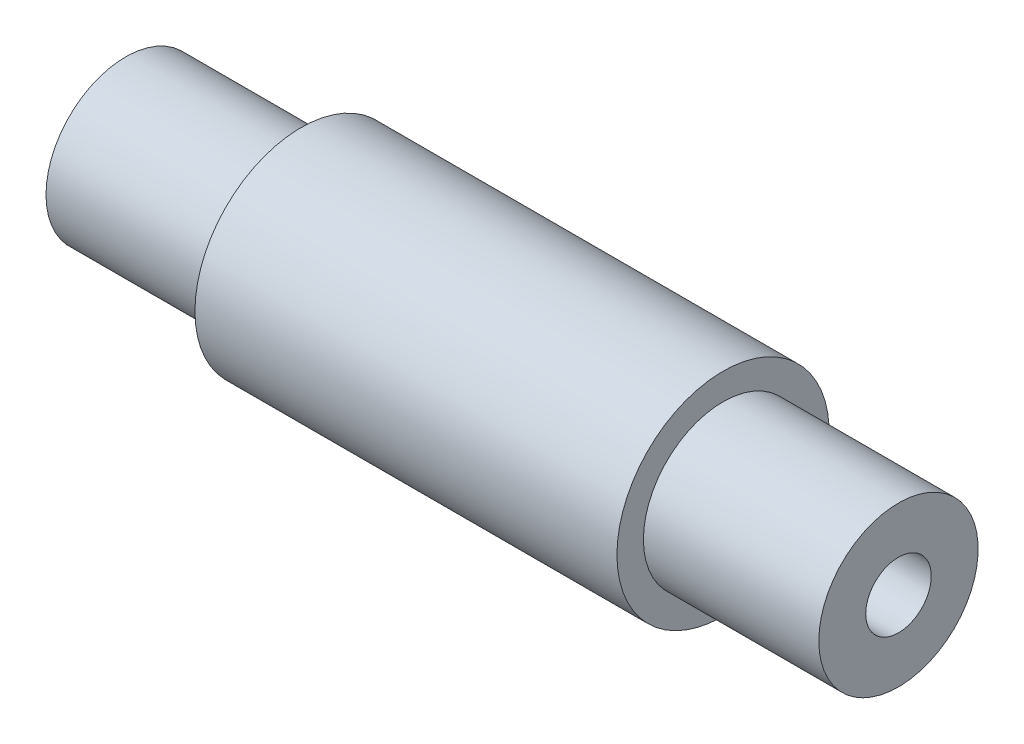
ISO-10303-21;
HEADER;
FILE_DESCRIPTION(('STEP AP214'),'2;1');
FILE_NAME('part.step','',(''),(''),'','','');
FILE_SCHEMA(('AUTOMOTIVE_DESIGN { 1 0 10303 214 1 1 1 1 }'));
ENDSEC;
DATA;
#1=APPLICATION_CONTEXT('core data for automotive mechanical design processes');
#2=APPLICATION_PROTOCOL_DEFINITION('international standard','automotive_design',2000,#1);
#3=PRODUCT_CONTEXT('',#1,'mechanical');
#4=PRODUCT('Part','Part','',(#3));
#5=PRODUCT_RELATED_PRODUCT_CATEGORY('part','',(#4));
#6=PRODUCT_DEFINITION_FORMATION('','',#4);
#7=PRODUCT_DEFINITION_CONTEXT('part definition',#1,'design');
#8=PRODUCT_DEFINITION('design','',#6,#7);
#9=PRODUCT_DEFINITION_SHAPE('','',#8);
#10=(LENGTH_UNIT() NAMED_UNIT(*) SI_UNIT(.MILLI.,.METRE.));
#11=(NAMED_UNIT(*) PLANE_ANGLE_UNIT() SI_UNIT($,.RADIAN.));
#12=(NAMED_UNIT(*) SI_UNIT($,.STERADIAN.) SOLID_ANGLE_UNIT());
#13=UNCERTAINTY_MEASURE_WITH_UNIT(LENGTH_MEASURE(1.E-05),#10,'distance_accuracy_value','');
#14=(GEOMETRIC_REPRESENTATION_CONTEXT(3) GLOBAL_UNCERTAINTY_ASSIGNED_CONTEXT((#13)) GLOBAL_UNIT_ASSIGNED_CONTEXT((#10,
#11,#12)) REPRESENTATION_CONTEXT('',''));
#15=CARTESIAN_POINT('',(0.,0.,0.));
#16=DIRECTION('',(0.,0.,1.));
#17=DIRECTION('',(1.,0.,0.));
#18=AXIS2_PLACEMENT_3D('',#15,#16,#17);
#19=CARTESIAN_POINT('',(-37.45,0.,0.));
#20=DIRECTION('',(1.,0.,0.));
#21=DIRECTION('',(0.,0.,-1.));
#22=AXIS2_PLACEMENT_3D('',#19,#20,#21);
#23=PLANE('',#22);
#24=CARTESIAN_POINT('',(-37.45,0.,0.));
#25=DIRECTION('',(1.,0.,0.));
#26=DIRECTION('',(0.,0.,-1.));
#27=AXIS2_PLACEMENT_3D('',#24,#25,#26);
#28=CIRCLE('',#27,3.175);
#29=CARTESIAN_POINT('',(-37.45,0.,-3.175));
#30=VERTEX_POINT('',#29);
#31=EDGE_CURVE('E53',#30,#30,#28,.F.);
#32=ORIENTED_EDGE('',*,*,#31,.F.);
#33=EDGE_LOOP('',(#32));
#34=FACE_BOUND('',#33,.T.);
#35=CARTESIAN_POINT('',(-37.45,0.,0.));
#36=DIRECTION('',(-1.,0.,0.));
#37=DIRECTION('',(0.,0.,1.));
#38=AXIS2_PLACEMENT_3D('',#35,#36,#37);
#39=CIRCLE('',#38,7.722);
#40=CARTESIAN_POINT('',(-37.45,0.,7.722));
#41=VERTEX_POINT('',#40);
#42=EDGE_CURVE('E10',#41,#41,#39,.T.);
#43=ORIENTED_EDGE('',*,*,#42,.T.);
#44=EDGE_LOOP('',(#43));
#45=FACE_BOUND('',#44,.T.);
#46=ADVANCED_FACE('F39',(#34,#45),#23,.F.);
#47=CARTESIAN_POINT('',(-1000.,0.,0.));
#48=DIRECTION('',(-1.,0.,0.));
#49=DIRECTION('',(0.,0.,1.));
#50=AXIS2_PLACEMENT_3D('',#47,#48,#49);
#51=CYLINDRICAL_SURFACE('',#50,7.722);
#52=ORIENTED_EDGE('',*,*,#42,.F.);
#53=EDGE_LOOP('',(#52));
#54=FACE_BOUND('',#53,.T.);
#55=CARTESIAN_POINT('',(-20.45,0.,0.));
#56=DIRECTION('',(-1.,0.,0.));
#57=DIRECTION('',(0.,0.,1.));
#58=AXIS2_PLACEMENT_3D('',#55,#56,#57);
#59=CIRCLE('',#58,7.722);
#60=CARTESIAN_POINT('',(-20.45,0.,7.722));
#61=VERTEX_POINT('',#60);
#62=EDGE_CURVE('E46',#61,#61,#59,.T.);
#63=ORIENTED_EDGE('',*,*,#62,.T.);
#64=EDGE_LOOP('',(#63));
#65=FACE_BOUND('',#64,.T.);
#66=ADVANCED_FACE('F114',(#54,#65),#51,.T.);
#67=CARTESIAN_POINT('',(-20.45,7.722,0.));
#68=DIRECTION('',(1.,0.,0.));
#69=DIRECTION('',(0.,0.,-1.));
#70=AXIS2_PLACEMENT_3D('',#67,#68,#69);
#71=PLANE('',#70);
#72=ORIENTED_EDGE('',*,*,#62,.F.);
#73=EDGE_LOOP('',(#72));
#74=FACE_BOUND('',#73,.T.);
#75=CARTESIAN_POINT('',(-20.45,0.,0.));
#76=DIRECTION('',(-1.,0.,0.));
#77=DIRECTION('',(0.,0.,1.));
#78=AXIS2_PLACEMENT_3D('',#75,#76,#77);
#79=CIRCLE('',#78,10.287);
#80=CARTESIAN_POINT('',(-20.45,0.,10.287));
#81=VERTEX_POINT('',#80);
#82=EDGE_CURVE('E51',#81,#81,#79,.T.);
#83=ORIENTED_EDGE('',*,*,#82,.T.);
#84=EDGE_LOOP('',(#83));
#85=FACE_BOUND('',#84,.T.);
#86=ADVANCED_FACE('F77',(#74,#85),#71,.F.);
#87=CARTESIAN_POINT('',(-1000.,0.,0.));
#88=DIRECTION('',(-1.,0.,0.));
#89=DIRECTION('',(0.,0.,1.));
#90=AXIS2_PLACEMENT_3D('',#87,#88,#89);
#91=CYLINDRICAL_SURFACE('',#90,10.287);
#92=ORIENTED_EDGE('',*,*,#82,.F.);
#93=EDGE_LOOP('',(#92));
#94=FACE_BOUND('',#93,.T.);
#95=CARTESIAN_POINT('',(20.4500000000001,0.,0.));
#96=DIRECTION('',(-1.,0.,0.));
#97=DIRECTION('',(0.,0.,1.));
#98=AXIS2_PLACEMENT_3D('',#95,#96,#97);
#99=CIRCLE('',#98,10.287);
#100=CARTESIAN_POINT('',(20.4500000000001,0.,10.287));
#101=VERTEX_POINT('',#100);
#102=EDGE_CURVE('E71',#101,#101,#99,.T.);
#103=ORIENTED_EDGE('',*,*,#102,.T.);
#104=EDGE_LOOP('',(#103));
#105=FACE_BOUND('',#104,.T.);
#106=ADVANCED_FACE('F76',(#94,#105),#91,.T.);
#107=CARTESIAN_POINT('',(20.45,10.287,0.));
#108=DIRECTION('',(-1.,0.,0.));
#109=DIRECTION('',(0.,0.,1.));
#110=AXIS2_PLACEMENT_3D('',#107,#108,#109);
#111=PLANE('',#110);
#112=ORIENTED_EDGE('',*,*,#102,.F.);
#113=EDGE_LOOP('',(#112));
#114=FACE_BOUND('',#113,.T.);
#115=CARTESIAN_POINT('',(20.4500000000001,0.,0.));
#116=DIRECTION('',(-1.,0.,0.));
#117=DIRECTION('',(0.,0.,1.));
#118=AXIS2_PLACEMENT_3D('',#115,#116,#117);
#119=CIRCLE('',#118,7.722);
#120=CARTESIAN_POINT('',(20.4500000000001,0.,7.722));
#121=VERTEX_POINT('',#120);
#122=EDGE_CURVE('E63',#121,#121,#119,.T.);
#123=ORIENTED_EDGE('',*,*,#122,.T.);
#124=EDGE_LOOP('',(#123));
#125=FACE_BOUND('',#124,.T.);
#126=ADVANCED_FACE('F84',(#114,#125),#111,.F.);
#127=CARTESIAN_POINT('',(-1000.,0.,0.));
#128=DIRECTION('',(-1.,0.,0.));
#129=DIRECTION('',(0.,0.,1.));
#130=AXIS2_PLACEMENT_3D('',#127,#128,#129);
#131=CYLINDRICAL_SURFACE('',#130,7.722);
#132=ORIENTED_EDGE('',*,*,#122,.F.);
#133=EDGE_LOOP('',(#132));
#134=FACE_BOUND('',#133,.T.);
#135=CARTESIAN_POINT('',(37.45,0.,0.));
#136=DIRECTION('',(-1.,0.,0.));
#137=DIRECTION('',(0.,0.,1.));
#138=AXIS2_PLACEMENT_3D('',#135,#136,#137);
#139=CIRCLE('',#138,7.722);
#140=CARTESIAN_POINT('',(37.45,0.,7.722));
#141=VERTEX_POINT('',#140);
#142=EDGE_CURVE('E57',#141,#141,#139,.T.);
#143=ORIENTED_EDGE('',*,*,#142,.T.);
#144=EDGE_LOOP('',(#143));
#145=FACE_BOUND('',#144,.T.);
#146=ADVANCED_FACE('F90',(#134,#145),#131,.T.);
#147=CARTESIAN_POINT('',(37.45,7.722,0.));
#148=DIRECTION('',(-1.,0.,0.));
#149=DIRECTION('',(0.,0.,1.));
#150=AXIS2_PLACEMENT_3D('',#147,#148,#149);
#151=PLANE('',#150);
#152=CARTESIAN_POINT('',(37.45,0.,0.));
#153=DIRECTION('',(-1.,0.,0.));
#154=DIRECTION('',(0.,0.,1.));
#155=AXIS2_PLACEMENT_3D('',#152,#153,#154);
#156=CIRCLE('',#155,3.175);
#157=CARTESIAN_POINT('',(37.45,0.,3.175));
#158=VERTEX_POINT('',#157);
#159=EDGE_CURVE('E45',#158,#158,#156,.F.);
#160=ORIENTED_EDGE('',*,*,#159,.F.);
#161=EDGE_LOOP('',(#160));
#162=FACE_BOUND('',#161,.T.);
#163=ORIENTED_EDGE('',*,*,#142,.F.);
#164=EDGE_LOOP('',(#163));
#165=FACE_BOUND('',#164,.T.);
#166=ADVANCED_FACE('F92',(#162,#165),#151,.F.);
#167=CARTESIAN_POINT('',(-1000.,0.,0.));
#168=DIRECTION('',(-1.,0.,0.));
#169=DIRECTION('',(0.,0.,1.));
#170=AXIS2_PLACEMENT_3D('',#167,#168,#169);
#171=CYLINDRICAL_SURFACE('',#170,3.175);
#172=CARTESIAN_POINT('',(-22.25,0.,0.));
#173=DIRECTION('',(-1.,0.,0.));
#174=DIRECTION('',(0.,0.,1.));
#175=AXIS2_PLACEMENT_3D('',#172,#173,#174);
#176=CIRCLE('',#175,3.175);
#177=CARTESIAN_POINT('',(-22.25,0.,3.175));
#178=VERTEX_POINT('',#177);
#179=EDGE_CURVE('E60',#178,#178,#176,.T.);
#180=ORIENTED_EDGE('',*,*,#179,.F.);
#181=EDGE_LOOP('',(#180));
#182=FACE_BOUND('',#181,.T.);
#183=ORIENTED_EDGE('',*,*,#31,.T.);
#184=EDGE_LOOP('',(#183));
#185=FACE_BOUND('',#184,.T.);
#186=ADVANCED_FACE('F99',(#182,#185),#171,.F.);
#187=CARTESIAN_POINT('',(-22.25,3.175,0.));
#188=DIRECTION('',(-1.,0.,0.));
#189=DIRECTION('',(0.,0.,1.));
#190=AXIS2_PLACEMENT_3D('',#187,#188,#189);
#191=PLANE('',#190);
#192=ORIENTED_EDGE('',*,*,#179,.T.);
#193=EDGE_LOOP('',(#192));
#194=FACE_BOUND('',#193,.T.);
#195=ADVANCED_FACE('F107',(#194),#191,.T.);
#196=CARTESIAN_POINT('',(-1000.,0.,0.));
#197=DIRECTION('',(-1.,0.,0.));
#198=DIRECTION('',(0.,0.,1.));
#199=AXIS2_PLACEMENT_3D('',#196,#197,#198);
#200=CYLINDRICAL_SURFACE('',#199,3.175);
#201=CARTESIAN_POINT('',(22.2500000000001,0.,0.));
#202=DIRECTION('',(-1.,0.,0.));
#203=DIRECTION('',(0.,0.,1.));
#204=AXIS2_PLACEMENT_3D('',#201,#202,#203);
#205=CIRCLE('',#204,3.175);
#206=CARTESIAN_POINT('',(22.2500000000001,0.,3.175));
#207=VERTEX_POINT('',#206);
#208=EDGE_CURVE('E69',#207,#207,#205,.T.);
#209=ORIENTED_EDGE('',*,*,#208,.T.);
#210=EDGE_LOOP('',(#209));
#211=FACE_BOUND('',#210,.T.);
#212=ORIENTED_EDGE('',*,*,#159,.T.);
#213=EDGE_LOOP('',(#212));
#214=FACE_BOUND('',#213,.T.);
#215=ADVANCED_FACE('F165',(#211,#214),#200,.F.);
#216=CARTESIAN_POINT('',(22.25,0.,0.));
#217=DIRECTION('',(1.,0.,0.));
#218=DIRECTION('',(0.,0.,-1.));
#219=AXIS2_PLACEMENT_3D('',#216,#217,#218);
#220=PLANE('',#219);
#221=ORIENTED_EDGE('',*,*,#208,.F.);
#222=EDGE_LOOP('',(#221));
#223=FACE_BOUND('',#222,.T.);
#224=ADVANCED_FACE('F168',(#223),#220,.T.);
#225=CLOSED_SHELL('',(#46,#66,#86,#106,#126,#146,#166,#186,#195,#215,#224));
#226=MANIFOLD_SOLID_BREP('B2',#225);
#227=ADVANCED_BREP_SHAPE_REPRESENTATION('',(#18,#226),#14);
#228=SHAPE_DEFINITION_REPRESENTATION(#9,#227);
ENDSEC;
END-ISO-10303-21;
